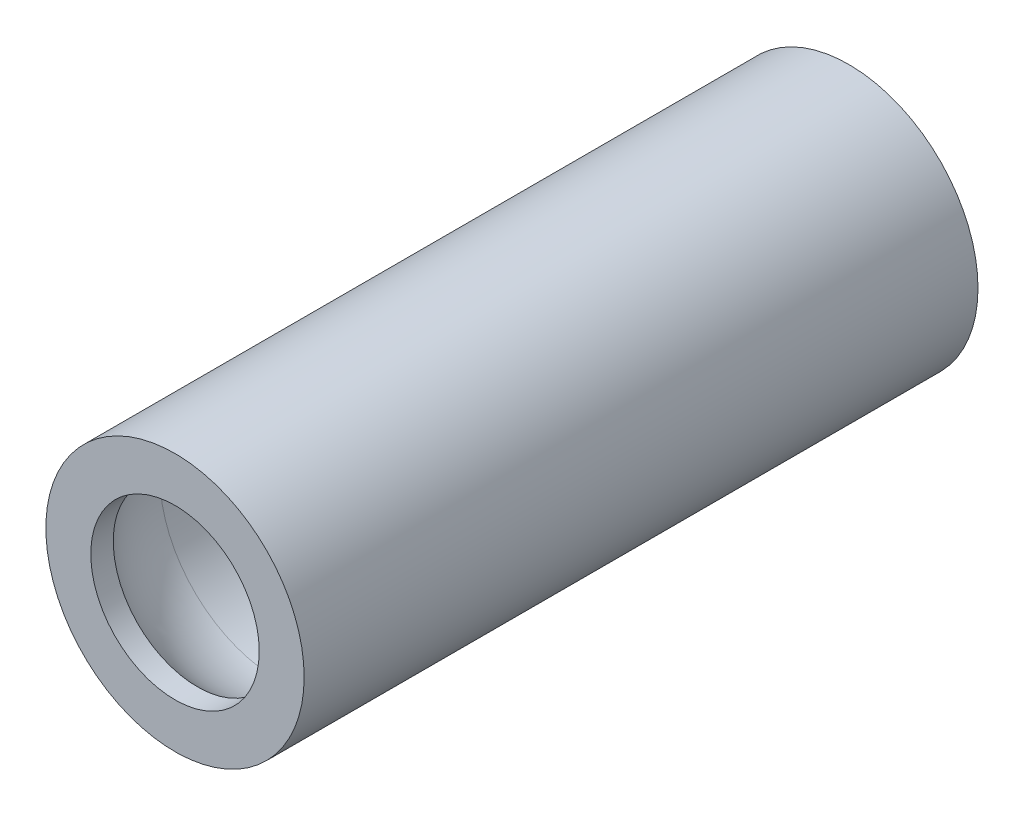
ISO-10303-21;
HEADER;
FILE_DESCRIPTION(('STEP AP214'),'2;1');
FILE_NAME('part.step','',(''),(''),'','','');
FILE_SCHEMA(('AUTOMOTIVE_DESIGN { 1 0 10303 214 1 1 1 1 }'));
ENDSEC;
DATA;
#1=APPLICATION_CONTEXT('core data for automotive mechanical design processes');
#2=APPLICATION_PROTOCOL_DEFINITION('international standard','automotive_design',2000,#1);
#3=PRODUCT_CONTEXT('',#1,'mechanical');
#4=PRODUCT('Part','Part','',(#3));
#5=PRODUCT_RELATED_PRODUCT_CATEGORY('part','',(#4));
#6=PRODUCT_DEFINITION_FORMATION('','',#4);
#7=PRODUCT_DEFINITION_CONTEXT('part definition',#1,'design');
#8=PRODUCT_DEFINITION('design','',#6,#7);
#9=PRODUCT_DEFINITION_SHAPE('','',#8);
#10=(LENGTH_UNIT() NAMED_UNIT(*) SI_UNIT(.MILLI.,.METRE.));
#11=(NAMED_UNIT(*) PLANE_ANGLE_UNIT() SI_UNIT($,.RADIAN.));
#12=(NAMED_UNIT(*) SI_UNIT($,.STERADIAN.) SOLID_ANGLE_UNIT());
#13=UNCERTAINTY_MEASURE_WITH_UNIT(LENGTH_MEASURE(1.E-05),#10,'distance_accuracy_value','');
#14=(GEOMETRIC_REPRESENTATION_CONTEXT(3) GLOBAL_UNCERTAINTY_ASSIGNED_CONTEXT((#13)) GLOBAL_UNIT_ASSIGNED_CONTEXT((#10,
#11,#12)) REPRESENTATION_CONTEXT('',''));
#15=CARTESIAN_POINT('',(0.,0.,0.));
#16=DIRECTION('',(0.,0.,1.));
#17=DIRECTION('',(1.,0.,0.));
#18=AXIS2_PLACEMENT_3D('',#15,#16,#17);
#19=CARTESIAN_POINT('',(0.,0.,60.));
#20=DIRECTION('',(0.,0.,-1.));
#21=DIRECTION('',(-1.,0.,0.));
#22=AXIS2_PLACEMENT_3D('',#19,#20,#21);
#23=CYLINDRICAL_SURFACE('',#22,10.5);
#24=CARTESIAN_POINT('',(0.,0.,9.14142842854285));
#25=DIRECTION('',(0.,0.,-1.));
#26=DIRECTION('',(-1.,0.,0.));
#27=AXIS2_PLACEMENT_3D('',#24,#25,#26);
#28=CIRCLE('',#27,10.5);
#29=CARTESIAN_POINT('',(-10.5,0.,9.14142842854285));
#30=VERTEX_POINT('',#29);
#31=EDGE_CURVE('E10',#30,#30,#28,.T.);
#32=ORIENTED_EDGE('',*,*,#31,.T.);
#33=EDGE_LOOP('',(#32));
#34=FACE_BOUND('',#33,.T.);
#35=CARTESIAN_POINT('',(0.,0.,50.8585715714571));
#36=DIRECTION('',(0.,0.,1.));
#37=DIRECTION('',(1.,0.,0.));
#38=AXIS2_PLACEMENT_3D('',#35,#36,#37);
#39=CIRCLE('',#38,10.5);
#40=CARTESIAN_POINT('',(10.5,0.,50.8585715714571));
#41=VERTEX_POINT('',#40);
#42=EDGE_CURVE('E45',#41,#41,#39,.T.);
#43=ORIENTED_EDGE('',*,*,#42,.T.);
#44=EDGE_LOOP('',(#43));
#45=FACE_BOUND('',#44,.T.);
#46=ADVANCED_FACE('F38',(#34,#45),#23,.F.);
#47=CARTESIAN_POINT('',(0.,0.,60.));
#48=DIRECTION('',(0.,0.,-1.));
#49=DIRECTION('',(-1.,0.,0.));
#50=AXIS2_PLACEMENT_3D('',#47,#48,#49);
#51=CYLINDRICAL_SURFACE('',#50,11.5);
#52=CARTESIAN_POINT('',(0.,0.,60.));
#53=DIRECTION('',(0.,0.,1.));
#54=DIRECTION('',(1.,0.,0.));
#55=AXIS2_PLACEMENT_3D('',#52,#53,#54);
#56=CIRCLE('',#55,11.5);
#57=CARTESIAN_POINT('',(11.5,0.,60.));
#58=VERTEX_POINT('',#57);
#59=EDGE_CURVE('E49',#58,#58,#56,.T.);
#60=ORIENTED_EDGE('',*,*,#59,.F.);
#61=EDGE_LOOP('',(#60));
#62=FACE_BOUND('',#61,.T.);
#63=CARTESIAN_POINT('',(0.,0.,0.));
#64=DIRECTION('',(0.,0.,1.));
#65=DIRECTION('',(1.,0.,0.));
#66=AXIS2_PLACEMENT_3D('',#63,#64,#65);
#67=CIRCLE('',#66,11.5);
#68=CARTESIAN_POINT('',(11.5,0.,0.));
#69=VERTEX_POINT('',#68);
#70=EDGE_CURVE('E53',#69,#69,#67,.T.);
#71=ORIENTED_EDGE('',*,*,#70,.T.);
#72=EDGE_LOOP('',(#71));
#73=FACE_BOUND('',#72,.T.);
#74=ADVANCED_FACE('F83',(#62,#73),#51,.T.);
#75=CARTESIAN_POINT('',(0.,0.,60.));
#76=DIRECTION('',(0.,0.,1.));
#77=DIRECTION('',(1.,0.,0.));
#78=AXIS2_PLACEMENT_3D('',#75,#76,#77);
#79=PLANE('',#78);
#80=ORIENTED_EDGE('',*,*,#59,.T.);
#81=EDGE_LOOP('',(#80));
#82=FACE_BOUND('',#81,.T.);
#83=CARTESIAN_POINT('',(0.,0.,60.));
#84=DIRECTION('',(0.,0.,1.));
#85=DIRECTION('',(1.,0.,0.));
#86=AXIS2_PLACEMENT_3D('',#83,#84,#85);
#87=CIRCLE('',#86,7.5);
#88=CARTESIAN_POINT('',(7.5,0.,60.));
#89=VERTEX_POINT('',#88);
#90=EDGE_CURVE('E65',#89,#89,#87,.T.);
#91=ORIENTED_EDGE('',*,*,#90,.F.);
#92=EDGE_LOOP('',(#91));
#93=FACE_BOUND('',#92,.T.);
#94=ADVANCED_FACE('F80',(#82,#93),#79,.T.);
#95=CARTESIAN_POINT('',(0.,0.,0.));
#96=DIRECTION('',(0.,0.,1.));
#97=DIRECTION('',(1.,0.,0.));
#98=AXIS2_PLACEMENT_3D('',#95,#96,#97);
#99=PLANE('',#98);
#100=ORIENTED_EDGE('',*,*,#70,.F.);
#101=EDGE_LOOP('',(#100));
#102=FACE_BOUND('',#101,.T.);
#103=CARTESIAN_POINT('',(0.,0.,0.));
#104=DIRECTION('',(0.,0.,1.));
#105=DIRECTION('',(1.,0.,0.));
#106=AXIS2_PLACEMENT_3D('',#103,#104,#105);
#107=CIRCLE('',#106,7.5);
#108=CARTESIAN_POINT('',(7.5,0.,0.));
#109=VERTEX_POINT('',#108);
#110=EDGE_CURVE('E59',#109,#109,#107,.T.);
#111=ORIENTED_EDGE('',*,*,#110,.T.);
#112=EDGE_LOOP('',(#111));
#113=FACE_BOUND('',#112,.T.);
#114=ADVANCED_FACE('F82',(#102,#113),#99,.F.);
#115=CARTESIAN_POINT('',(0.,0.,2.));
#116=DIRECTION('',(0.,0.,-1.));
#117=DIRECTION('',(-1.,0.,0.));
#118=AXIS2_PLACEMENT_3D('',#115,#116,#117);
#119=CYLINDRICAL_SURFACE('',#118,7.5);
#120=CARTESIAN_POINT('',(0.,0.,2.));
#121=DIRECTION('',(0.,0.,1.));
#122=DIRECTION('',(1.,0.,0.));
#123=AXIS2_PLACEMENT_3D('',#120,#121,#122);
#124=CIRCLE('',#123,7.5);
#125=CARTESIAN_POINT('',(7.5,0.,2.));
#126=VERTEX_POINT('',#125);
#127=EDGE_CURVE('E57',#126,#126,#124,.T.);
#128=ORIENTED_EDGE('',*,*,#127,.T.);
#129=EDGE_LOOP('',(#128));
#130=FACE_BOUND('',#129,.T.);
#131=ORIENTED_EDGE('',*,*,#110,.F.);
#132=EDGE_LOOP('',(#131));
#133=FACE_BOUND('',#132,.T.);
#134=ADVANCED_FACE('F76',(#130,#133),#119,.F.);
#135=CARTESIAN_POINT('',(0.,0.,58.));
#136=DIRECTION('',(0.,0.,1.));
#137=DIRECTION('',(1.,0.,0.));
#138=AXIS2_PLACEMENT_3D('',#135,#136,#137);
#139=CYLINDRICAL_SURFACE('',#138,7.5);
#140=CARTESIAN_POINT('',(0.,0.,58.));
#141=DIRECTION('',(0.,0.,1.));
#142=DIRECTION('',(1.,0.,0.));
#143=AXIS2_PLACEMENT_3D('',#140,#141,#142);
#144=CIRCLE('',#143,7.5);
#145=CARTESIAN_POINT('',(7.5,0.,58.));
#146=VERTEX_POINT('',#145);
#147=EDGE_CURVE('E62',#146,#146,#144,.T.);
#148=ORIENTED_EDGE('',*,*,#147,.F.);
#149=EDGE_LOOP('',(#148));
#150=FACE_BOUND('',#149,.T.);
#151=ORIENTED_EDGE('',*,*,#90,.T.);
#152=EDGE_LOOP('',(#151));
#153=FACE_BOUND('',#152,.T.);
#154=ADVANCED_FACE('F72',(#150,#153),#139,.F.);
#155=CARTESIAN_POINT('',(0.,0.,9.14142842854285));
#156=DIRECTION('',(0.,0.,-1.));
#157=DIRECTION('',(-1.,0.,0.));
#158=AXIS2_PLACEMENT_3D('',#155,#156,#157);
#159=DEGENERATE_TOROIDAL_SURFACE('',#158,0.499999999999999,10.,.T.);
#160=ORIENTED_EDGE('',*,*,#31,.F.);
#161=EDGE_LOOP('',(#160));
#162=FACE_BOUND('',#161,.T.);
#163=ORIENTED_EDGE('',*,*,#127,.F.);
#164=EDGE_LOOP('',(#163));
#165=FACE_BOUND('',#164,.T.);
#166=ADVANCED_FACE('F75',(#162,#165),#159,.F.);
#167=CARTESIAN_POINT('',(0.,0.,50.8585715714571));
#168=DIRECTION('',(0.,0.,1.));
#169=DIRECTION('',(1.,0.,0.));
#170=AXIS2_PLACEMENT_3D('',#167,#168,#169);
#171=DEGENERATE_TOROIDAL_SURFACE('',#170,0.499999999999999,10.,.T.);
#172=ORIENTED_EDGE('',*,*,#42,.F.);
#173=EDGE_LOOP('',(#172));
#174=FACE_BOUND('',#173,.T.);
#175=ORIENTED_EDGE('',*,*,#147,.T.);
#176=EDGE_LOOP('',(#175));
#177=FACE_BOUND('',#176,.T.);
#178=ADVANCED_FACE('F40',(#174,#177),#171,.F.);
#179=CLOSED_SHELL('',(#46,#74,#94,#114,#134,#154,#166,#178));
#180=MANIFOLD_SOLID_BREP('B2',#179);
#181=ADVANCED_BREP_SHAPE_REPRESENTATION('',(#18,#180),#14);
#182=SHAPE_DEFINITION_REPRESENTATION(#9,#181);
ENDSEC;
END-ISO-10303-21;
